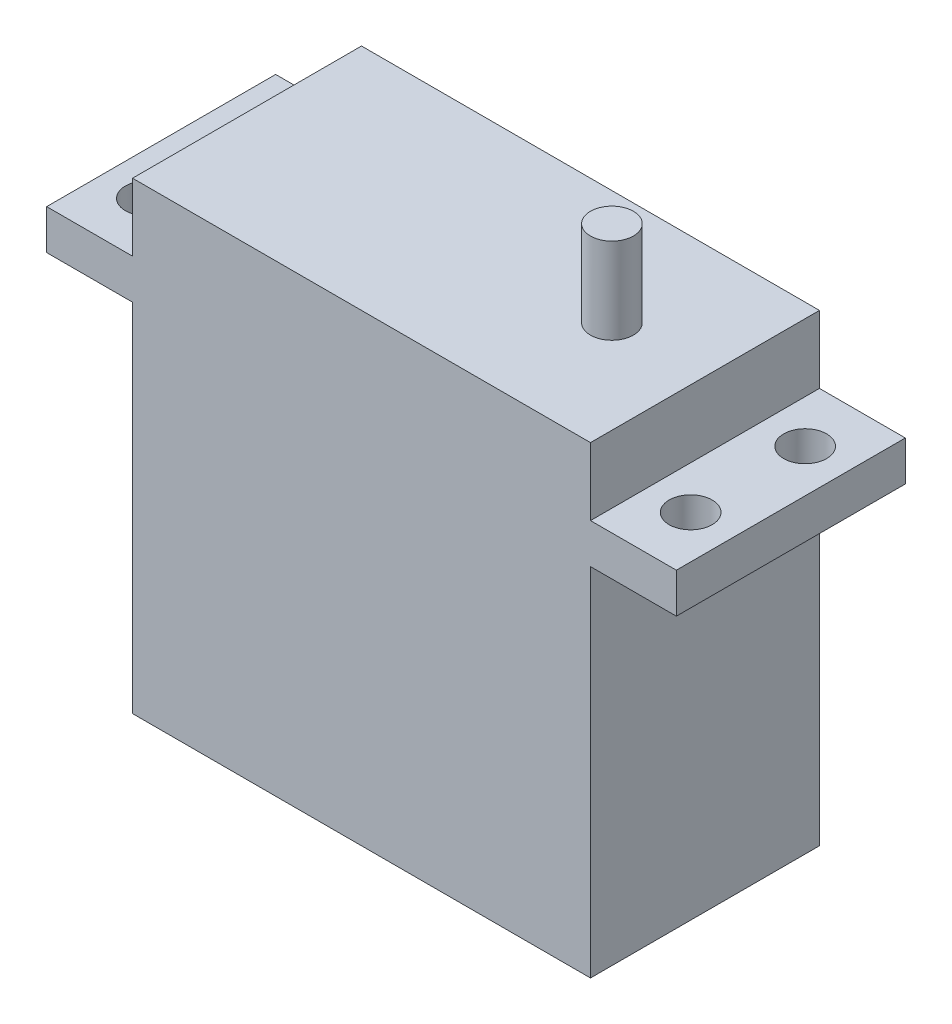
ISO-10303-21;
HEADER;
FILE_DESCRIPTION(('STEP AP214'),'2;1');
FILE_NAME('part.step','',(''),(''),'','','');
FILE_SCHEMA(('AUTOMOTIVE_DESIGN { 1 0 10303 214 1 1 1 1 }'));
ENDSEC;
DATA;
#1=APPLICATION_CONTEXT('core data for automotive mechanical design processes');
#2=APPLICATION_PROTOCOL_DEFINITION('international standard','automotive_design',2000,#1);
#3=PRODUCT_CONTEXT('',#1,'mechanical');
#4=PRODUCT('Part','Part','',(#3));
#5=PRODUCT_RELATED_PRODUCT_CATEGORY('part','',(#4));
#6=PRODUCT_DEFINITION_FORMATION('','',#4);
#7=PRODUCT_DEFINITION_CONTEXT('part definition',#1,'design');
#8=PRODUCT_DEFINITION('design','',#6,#7);
#9=PRODUCT_DEFINITION_SHAPE('','',#8);
#10=(LENGTH_UNIT() NAMED_UNIT(*) SI_UNIT(.MILLI.,.METRE.));
#11=(NAMED_UNIT(*) PLANE_ANGLE_UNIT() SI_UNIT($,.RADIAN.));
#12=(NAMED_UNIT(*) SI_UNIT($,.STERADIAN.) SOLID_ANGLE_UNIT());
#13=UNCERTAINTY_MEASURE_WITH_UNIT(LENGTH_MEASURE(1.E-05),#10,'distance_accuracy_value','');
#14=(GEOMETRIC_REPRESENTATION_CONTEXT(3) GLOBAL_UNCERTAINTY_ASSIGNED_CONTEXT((#13)) GLOBAL_UNIT_ASSIGNED_CONTEXT((#10,
#11,#12)) REPRESENTATION_CONTEXT('',''));
#15=CARTESIAN_POINT('',(0.,0.,0.));
#16=DIRECTION('',(0.,0.,1.));
#17=DIRECTION('',(1.,0.,0.));
#18=AXIS2_PLACEMENT_3D('',#15,#16,#17);
#19=CARTESIAN_POINT('',(0.,40.5,0.));
#20=DIRECTION('',(1.,0.,0.));
#21=DIRECTION('',(0.,0.,-1.));
#22=AXIS2_PLACEMENT_3D('',#19,#20,#21);
#23=PLANE('',#22);
#24=DIRECTION('',(0.,-1.,0.));
#25=VECTOR('',#24,1.);
#26=CARTESIAN_POINT('',(0.,40.5,-20.));
#27=LINE('',#26,#25);
#28=CARTESIAN_POINT('',(0.,40.5,-20.));
#29=VERTEX_POINT('',#28);
#30=CARTESIAN_POINT('',(0.,34.6,-20.));
#31=VERTEX_POINT('',#30);
#32=EDGE_CURVE('E207',#29,#31,#27,.T.);
#33=ORIENTED_EDGE('',*,*,#32,.T.);
#34=DIRECTION('',(0.,0.,1.));
#35=VECTOR('',#34,1.);
#36=CARTESIAN_POINT('',(0.,34.6,0.));
#37=LINE('',#36,#35);
#38=CARTESIAN_POINT('',(0.,34.6,0.));
#39=VERTEX_POINT('',#38);
#40=EDGE_CURVE('E183',#31,#39,#37,.T.);
#41=ORIENTED_EDGE('',*,*,#40,.T.);
#42=DIRECTION('',(0.,-1.,0.));
#43=VECTOR('',#42,1.);
#44=CARTESIAN_POINT('',(0.,40.5,0.));
#45=LINE('',#44,#43);
#46=CARTESIAN_POINT('',(0.,40.5,0.));
#47=VERTEX_POINT('',#46);
#48=EDGE_CURVE('E44',#47,#39,#45,.T.);
#49=ORIENTED_EDGE('',*,*,#48,.F.);
#50=DIRECTION('',(0.,0.,1.));
#51=VECTOR('',#50,1.);
#52=CARTESIAN_POINT('',(0.,40.5,0.));
#53=LINE('',#52,#51);
#54=EDGE_CURVE('E187',#29,#47,#53,.T.);
#55=ORIENTED_EDGE('',*,*,#54,.F.);
#56=EDGE_LOOP('',(#33,#41,#49,#55));
#57=FACE_BOUND('',#56,.T.);
#58=ADVANCED_FACE('F36',(#57),#23,.F.);
#59=CARTESIAN_POINT('',(40.,40.5,0.));
#60=DIRECTION('',(-1.,0.,0.));
#61=DIRECTION('',(0.,0.,1.));
#62=AXIS2_PLACEMENT_3D('',#59,#60,#61);
#63=PLANE('',#62);
#64=DIRECTION('',(0.,-1.,0.));
#65=VECTOR('',#64,1.);
#66=CARTESIAN_POINT('',(40.,40.5,0.));
#67=LINE('',#66,#65);
#68=CARTESIAN_POINT('',(40.,40.5,0.));
#69=VERTEX_POINT('',#68);
#70=CARTESIAN_POINT('',(40.,34.6,0.));
#71=VERTEX_POINT('',#70);
#72=EDGE_CURVE('E214',#69,#71,#67,.T.);
#73=ORIENTED_EDGE('',*,*,#72,.T.);
#74=DIRECTION('',(0.,0.,-1.));
#75=VECTOR('',#74,1.);
#76=CARTESIAN_POINT('',(40.,34.6,0.));
#77=LINE('',#76,#75);
#78=CARTESIAN_POINT('',(40.,34.6,-20.));
#79=VERTEX_POINT('',#78);
#80=EDGE_CURVE('E180',#71,#79,#77,.T.);
#81=ORIENTED_EDGE('',*,*,#80,.T.);
#82=DIRECTION('',(0.,-1.,0.));
#83=VECTOR('',#82,1.);
#84=CARTESIAN_POINT('',(40.,40.5,-20.));
#85=LINE('',#84,#83);
#86=CARTESIAN_POINT('',(40.,40.5,-20.));
#87=VERTEX_POINT('',#86);
#88=EDGE_CURVE('E211',#87,#79,#85,.T.);
#89=ORIENTED_EDGE('',*,*,#88,.F.);
#90=DIRECTION('',(0.,0.,-1.));
#91=VECTOR('',#90,1.);
#92=CARTESIAN_POINT('',(40.,40.5,0.));
#93=LINE('',#92,#91);
#94=EDGE_CURVE('E193',#69,#87,#93,.T.);
#95=ORIENTED_EDGE('',*,*,#94,.F.);
#96=EDGE_LOOP('',(#73,#81,#89,#95));
#97=FACE_BOUND('',#96,.T.);
#98=ADVANCED_FACE('F271',(#97),#63,.F.);
#99=CARTESIAN_POINT('',(0.,31.12,0.));
#100=VERTEX_POINT('',#99);
#101=CARTESIAN_POINT('',(0.,0.,0.));
#102=VERTEX_POINT('',#101);
#103=EDGE_CURVE('E217',#100,#102,#45,.T.);
#104=ORIENTED_EDGE('',*,*,#103,.F.);
#105=DIRECTION('',(0.,0.,-1.));
#106=VECTOR('',#105,1.);
#107=CARTESIAN_POINT('',(0.,31.12,0.));
#108=LINE('',#107,#106);
#109=CARTESIAN_POINT('',(0.,31.12,-20.));
#110=VERTEX_POINT('',#109);
#111=EDGE_CURVE('E178',#100,#110,#108,.T.);
#112=ORIENTED_EDGE('',*,*,#111,.T.);
#113=CARTESIAN_POINT('',(0.,0.,-20.));
#114=VERTEX_POINT('',#113);
#115=EDGE_CURVE('E197',#110,#114,#27,.T.);
#116=ORIENTED_EDGE('',*,*,#115,.T.);
#117=DIRECTION('',(0.,0.,1.));
#118=VECTOR('',#117,1.);
#119=CARTESIAN_POINT('',(0.,0.,0.));
#120=LINE('',#119,#118);
#121=EDGE_CURVE('E186',#114,#102,#120,.T.);
#122=ORIENTED_EDGE('',*,*,#121,.T.);
#123=EDGE_LOOP('',(#104,#112,#116,#122));
#124=FACE_BOUND('',#123,.T.);
#125=ADVANCED_FACE('F38',(#124),#23,.F.);
#126=CARTESIAN_POINT('',(0.,40.5,0.));
#127=DIRECTION('',(0.,0.,-1.));
#128=DIRECTION('',(-1.,0.,0.));
#129=AXIS2_PLACEMENT_3D('',#126,#127,#128);
#130=PLANE('',#129);
#131=CARTESIAN_POINT('',(40.,31.12,0.));
#132=VERTEX_POINT('',#131);
#133=CARTESIAN_POINT('',(40.,0.,0.));
#134=VERTEX_POINT('',#133);
#135=EDGE_CURVE('E130',#132,#134,#67,.T.);
#136=ORIENTED_EDGE('',*,*,#135,.F.);
#137=DIRECTION('',(1.,0.,0.));
#138=VECTOR('',#137,1.);
#139=CARTESIAN_POINT('',(-7.5,31.12,0.));
#140=LINE('',#139,#138);
#141=CARTESIAN_POINT('',(47.5,31.12,0.));
#142=VERTEX_POINT('',#141);
#143=EDGE_CURVE('E51',#132,#142,#140,.T.);
#144=ORIENTED_EDGE('',*,*,#143,.T.);
#145=DIRECTION('',(0.,-1.,0.));
#146=VECTOR('',#145,1.);
#147=CARTESIAN_POINT('',(47.5,31.12,0.));
#148=LINE('',#147,#146);
#149=CARTESIAN_POINT('',(47.5,34.6,0.));
#150=VERTEX_POINT('',#149);
#151=EDGE_CURVE('E128',#150,#142,#148,.T.);
#152=ORIENTED_EDGE('',*,*,#151,.F.);
#153=DIRECTION('',(1.,0.,0.));
#154=VECTOR('',#153,1.);
#155=CARTESIAN_POINT('',(-7.5,34.6,0.));
#156=LINE('',#155,#154);
#157=EDGE_CURVE('E170',#71,#150,#156,.T.);
#158=ORIENTED_EDGE('',*,*,#157,.F.);
#159=ORIENTED_EDGE('',*,*,#72,.F.);
#160=DIRECTION('',(1.,0.,0.));
#161=VECTOR('',#160,1.);
#162=CARTESIAN_POINT('',(0.,40.5,0.));
#163=LINE('',#162,#161);
#164=EDGE_CURVE('E190',#47,#69,#163,.T.);
#165=ORIENTED_EDGE('',*,*,#164,.F.);
#166=ORIENTED_EDGE('',*,*,#48,.T.);
#167=CARTESIAN_POINT('',(-7.5,34.6,0.));
#168=VERTEX_POINT('',#167);
#169=EDGE_CURVE('E167',#168,#39,#156,.T.);
#170=ORIENTED_EDGE('',*,*,#169,.F.);
#171=DIRECTION('',(0.,-1.,0.));
#172=VECTOR('',#171,1.);
#173=CARTESIAN_POINT('',(-7.5,31.12,0.));
#174=LINE('',#173,#172);
#175=CARTESIAN_POINT('',(-7.5,31.12,0.));
#176=VERTEX_POINT('',#175);
#177=EDGE_CURVE('E157',#168,#176,#174,.T.);
#178=ORIENTED_EDGE('',*,*,#177,.T.);
#179=EDGE_CURVE('E131',#176,#100,#140,.T.);
#180=ORIENTED_EDGE('',*,*,#179,.T.);
#181=ORIENTED_EDGE('',*,*,#103,.T.);
#182=DIRECTION('',(1.,0.,0.));
#183=VECTOR('',#182,1.);
#184=CARTESIAN_POINT('',(0.,0.,0.));
#185=LINE('',#184,#183);
#186=EDGE_CURVE('E200',#102,#134,#185,.T.);
#187=ORIENTED_EDGE('',*,*,#186,.T.);
#188=EDGE_LOOP('',(#136,#144,#152,#158,#159,#165,#166,#170,#178,#180,#181,#187));
#189=FACE_BOUND('',#188,.T.);
#190=ADVANCED_FACE('F125',(#189),#130,.F.);
#191=CARTESIAN_POINT('',(40.,31.12,-20.));
#192=VERTEX_POINT('',#191);
#193=CARTESIAN_POINT('',(40.,0.,-20.));
#194=VERTEX_POINT('',#193);
#195=EDGE_CURVE('E210',#192,#194,#85,.T.);
#196=ORIENTED_EDGE('',*,*,#195,.F.);
#197=DIRECTION('',(0.,0.,1.));
#198=VECTOR('',#197,1.);
#199=CARTESIAN_POINT('',(40.,31.12,0.));
#200=LINE('',#199,#198);
#201=EDGE_CURVE('E169',#192,#132,#200,.T.);
#202=ORIENTED_EDGE('',*,*,#201,.T.);
#203=ORIENTED_EDGE('',*,*,#135,.T.);
#204=DIRECTION('',(0.,0.,-1.));
#205=VECTOR('',#204,1.);
#206=CARTESIAN_POINT('',(40.,0.,0.));
#207=LINE('',#206,#205);
#208=EDGE_CURVE('E202',#134,#194,#207,.T.);
#209=ORIENTED_EDGE('',*,*,#208,.T.);
#210=EDGE_LOOP('',(#196,#202,#203,#209));
#211=FACE_BOUND('',#210,.T.);
#212=ADVANCED_FACE('F290',(#211),#63,.F.);
#213=CARTESIAN_POINT('',(0.,40.5,-20.));
#214=DIRECTION('',(0.,0.,1.));
#215=DIRECTION('',(1.,0.,0.));
#216=AXIS2_PLACEMENT_3D('',#213,#214,#215);
#217=PLANE('',#216);
#218=ORIENTED_EDGE('',*,*,#115,.F.);
#219=DIRECTION('',(1.,0.,0.));
#220=VECTOR('',#219,1.);
#221=CARTESIAN_POINT('',(-7.5,31.12,-20.));
#222=LINE('',#221,#220);
#223=CARTESIAN_POINT('',(-7.5,31.12,-20.));
#224=VERTEX_POINT('',#223);
#225=EDGE_CURVE('E59',#224,#110,#222,.T.);
#226=ORIENTED_EDGE('',*,*,#225,.F.);
#227=DIRECTION('',(0.,1.,0.));
#228=VECTOR('',#227,1.);
#229=CARTESIAN_POINT('',(-7.5,31.12,-20.));
#230=LINE('',#229,#228);
#231=CARTESIAN_POINT('',(-7.5,34.6,-20.));
#232=VERTEX_POINT('',#231);
#233=EDGE_CURVE('E162',#224,#232,#230,.T.);
#234=ORIENTED_EDGE('',*,*,#233,.T.);
#235=DIRECTION('',(1.,0.,0.));
#236=VECTOR('',#235,1.);
#237=CARTESIAN_POINT('',(-7.5,34.6,-20.));
#238=LINE('',#237,#236);
#239=EDGE_CURVE('E171',#232,#31,#238,.T.);
#240=ORIENTED_EDGE('',*,*,#239,.T.);
#241=ORIENTED_EDGE('',*,*,#32,.F.);
#242=DIRECTION('',(-1.,0.,0.));
#243=VECTOR('',#242,1.);
#244=CARTESIAN_POINT('',(0.,40.5,-20.));
#245=LINE('',#244,#243);
#246=EDGE_CURVE('E195',#87,#29,#245,.T.);
#247=ORIENTED_EDGE('',*,*,#246,.F.);
#248=ORIENTED_EDGE('',*,*,#88,.T.);
#249=CARTESIAN_POINT('',(47.5,34.6,-20.));
#250=VERTEX_POINT('',#249);
#251=EDGE_CURVE('E174',#79,#250,#238,.T.);
#252=ORIENTED_EDGE('',*,*,#251,.T.);
#253=DIRECTION('',(0.,1.,0.));
#254=VECTOR('',#253,1.);
#255=CARTESIAN_POINT('',(47.5,31.12,-20.));
#256=LINE('',#255,#254);
#257=CARTESIAN_POINT('',(47.5,31.12,-20.));
#258=VERTEX_POINT('',#257);
#259=EDGE_CURVE('E142',#258,#250,#256,.T.);
#260=ORIENTED_EDGE('',*,*,#259,.F.);
#261=EDGE_CURVE('E138',#192,#258,#222,.T.);
#262=ORIENTED_EDGE('',*,*,#261,.F.);
#263=ORIENTED_EDGE('',*,*,#195,.T.);
#264=DIRECTION('',(-1.,0.,0.));
#265=VECTOR('',#264,1.);
#266=CARTESIAN_POINT('',(0.,0.,-20.));
#267=LINE('',#266,#265);
#268=EDGE_CURVE('E191',#194,#114,#267,.T.);
#269=ORIENTED_EDGE('',*,*,#268,.T.);
#270=EDGE_LOOP('',(#218,#226,#234,#240,#241,#247,#248,#252,#260,#262,#263,#269));
#271=FACE_BOUND('',#270,.T.);
#272=ADVANCED_FACE('F259',(#271),#217,.F.);
#273=CARTESIAN_POINT('',(0.,40.5,0.));
#274=DIRECTION('',(0.,-1.,0.));
#275=DIRECTION('',(0.,0.,-1.));
#276=AXIS2_PLACEMENT_3D('',#273,#274,#275);
#277=PLANE('',#276);
#278=CARTESIAN_POINT('',(31.8724,40.5,-10.));
#279=DIRECTION('',(0.,-1.,0.));
#280=DIRECTION('',(0.,0.,-1.));
#281=AXIS2_PLACEMENT_3D('',#278,#279,#280);
#282=CIRCLE('',#281,1.875);
#283=CARTESIAN_POINT('',(31.8724,40.5,-11.875));
#284=VERTEX_POINT('',#283);
#285=EDGE_CURVE('E11',#284,#284,#282,.F.);
#286=ORIENTED_EDGE('',*,*,#285,.F.);
#287=EDGE_LOOP('',(#286));
#288=FACE_BOUND('',#287,.T.);
#289=ORIENTED_EDGE('',*,*,#54,.T.);
#290=ORIENTED_EDGE('',*,*,#164,.T.);
#291=ORIENTED_EDGE('',*,*,#94,.T.);
#292=ORIENTED_EDGE('',*,*,#246,.T.);
#293=EDGE_LOOP('',(#289,#290,#291,#292));
#294=FACE_BOUND('',#293,.T.);
#295=ADVANCED_FACE('F255',(#288,#294),#277,.F.);
#296=CARTESIAN_POINT('',(0.,0.,0.));
#297=DIRECTION('',(0.,-1.,0.));
#298=DIRECTION('',(0.,0.,-1.));
#299=AXIS2_PLACEMENT_3D('',#296,#297,#298);
#300=PLANE('',#299);
#301=ORIENTED_EDGE('',*,*,#121,.F.);
#302=ORIENTED_EDGE('',*,*,#268,.F.);
#303=ORIENTED_EDGE('',*,*,#208,.F.);
#304=ORIENTED_EDGE('',*,*,#186,.F.);
#305=EDGE_LOOP('',(#301,#302,#303,#304));
#306=FACE_BOUND('',#305,.T.);
#307=ADVANCED_FACE('F258',(#306),#300,.T.);
#308=CARTESIAN_POINT('',(47.5,0.,0.));
#309=DIRECTION('',(-1.,0.,0.));
#310=DIRECTION('',(0.,0.,1.));
#311=AXIS2_PLACEMENT_3D('',#308,#309,#310);
#312=PLANE('',#311);
#313=ORIENTED_EDGE('',*,*,#151,.T.);
#314=DIRECTION('',(0.,0.,-1.));
#315=VECTOR('',#314,1.);
#316=CARTESIAN_POINT('',(47.5,31.12,0.));
#317=LINE('',#316,#315);
#318=EDGE_CURVE('E135',#142,#258,#317,.T.);
#319=ORIENTED_EDGE('',*,*,#318,.T.);
#320=ORIENTED_EDGE('',*,*,#259,.T.);
#321=DIRECTION('',(0.,0.,1.));
#322=VECTOR('',#321,1.);
#323=CARTESIAN_POINT('',(47.5,34.6,0.));
#324=LINE('',#323,#322);
#325=EDGE_CURVE('E147',#250,#150,#324,.T.);
#326=ORIENTED_EDGE('',*,*,#325,.T.);
#327=EDGE_LOOP('',(#313,#319,#320,#326));
#328=FACE_BOUND('',#327,.T.);
#329=ADVANCED_FACE('F145',(#328),#312,.F.);
#330=CARTESIAN_POINT('',(-7.5,31.12,0.));
#331=DIRECTION('',(0.,-1.,0.));
#332=DIRECTION('',(0.,0.,-1.));
#333=AXIS2_PLACEMENT_3D('',#330,#331,#332);
#334=PLANE('',#333);
#335=CARTESIAN_POINT('',(43.75,31.12,-5.));
#336=DIRECTION('',(0.,-1.,0.));
#337=DIRECTION('',(0.,0.,-1.));
#338=AXIS2_PLACEMENT_3D('',#335,#336,#337);
#339=CIRCLE('',#338,1.875);
#340=CARTESIAN_POINT('',(43.75,31.12,-6.875));
#341=VERTEX_POINT('',#340);
#342=EDGE_CURVE('E148',#341,#341,#339,.T.);
#343=ORIENTED_EDGE('',*,*,#342,.F.);
#344=EDGE_LOOP('',(#343));
#345=FACE_BOUND('',#344,.T.);
#346=CARTESIAN_POINT('',(43.75,31.12,-15.));
#347=DIRECTION('',(0.,-1.,0.));
#348=DIRECTION('',(0.,0.,-1.));
#349=AXIS2_PLACEMENT_3D('',#346,#347,#348);
#350=CIRCLE('',#349,1.875);
#351=CARTESIAN_POINT('',(43.75,31.12,-16.875));
#352=VERTEX_POINT('',#351);
#353=EDGE_CURVE('E151',#352,#352,#350,.T.);
#354=ORIENTED_EDGE('',*,*,#353,.F.);
#355=EDGE_LOOP('',(#354));
#356=FACE_BOUND('',#355,.T.);
#357=ORIENTED_EDGE('',*,*,#201,.F.);
#358=ORIENTED_EDGE('',*,*,#261,.T.);
#359=ORIENTED_EDGE('',*,*,#318,.F.);
#360=ORIENTED_EDGE('',*,*,#143,.F.);
#361=EDGE_LOOP('',(#357,#358,#359,#360));
#362=FACE_BOUND('',#361,.T.);
#363=ADVANCED_FACE('F136',(#345,#356,#362),#334,.T.);
#364=CARTESIAN_POINT('',(-7.5,34.6,0.));
#365=DIRECTION('',(0.,1.,0.));
#366=DIRECTION('',(0.,0.,1.));
#367=AXIS2_PLACEMENT_3D('',#364,#365,#366);
#368=PLANE('',#367);
#369=CARTESIAN_POINT('',(43.75,34.6,-5.));
#370=DIRECTION('',(0.,1.,0.));
#371=DIRECTION('',(0.,0.,1.));
#372=AXIS2_PLACEMENT_3D('',#369,#370,#371);
#373=CIRCLE('',#372,1.875);
#374=CARTESIAN_POINT('',(43.75,34.6,-3.125));
#375=VERTEX_POINT('',#374);
#376=EDGE_CURVE('E233',#375,#375,#373,.T.);
#377=ORIENTED_EDGE('',*,*,#376,.F.);
#378=EDGE_LOOP('',(#377));
#379=FACE_BOUND('',#378,.T.);
#380=CARTESIAN_POINT('',(43.75,34.6,-15.));
#381=DIRECTION('',(0.,1.,0.));
#382=DIRECTION('',(0.,0.,1.));
#383=AXIS2_PLACEMENT_3D('',#380,#381,#382);
#384=CIRCLE('',#383,1.875);
#385=CARTESIAN_POINT('',(43.75,34.6,-13.125));
#386=VERTEX_POINT('',#385);
#387=EDGE_CURVE('E223',#386,#386,#384,.T.);
#388=ORIENTED_EDGE('',*,*,#387,.F.);
#389=EDGE_LOOP('',(#388));
#390=FACE_BOUND('',#389,.T.);
#391=ORIENTED_EDGE('',*,*,#80,.F.);
#392=ORIENTED_EDGE('',*,*,#157,.T.);
#393=ORIENTED_EDGE('',*,*,#325,.F.);
#394=ORIENTED_EDGE('',*,*,#251,.F.);
#395=EDGE_LOOP('',(#391,#392,#393,#394));
#396=FACE_BOUND('',#395,.T.);
#397=ADVANCED_FACE('F292',(#379,#390,#396),#368,.T.);
#398=CARTESIAN_POINT('',(-3.75,34.6,-15.));
#399=DIRECTION('',(0.,1.,0.));
#400=DIRECTION('',(0.,0.,1.));
#401=AXIS2_PLACEMENT_3D('',#398,#399,#400);
#402=CIRCLE('',#401,1.875);
#403=CARTESIAN_POINT('',(-3.75,34.6,-13.125));
#404=VERTEX_POINT('',#403);
#405=EDGE_CURVE('E234',#404,#404,#402,.T.);
#406=ORIENTED_EDGE('',*,*,#405,.F.);
#407=EDGE_LOOP('',(#406));
#408=FACE_BOUND('',#407,.T.);
#409=CARTESIAN_POINT('',(-3.75,34.6,-5.));
#410=DIRECTION('',(0.,1.,0.));
#411=DIRECTION('',(0.,0.,1.));
#412=AXIS2_PLACEMENT_3D('',#409,#410,#411);
#413=CIRCLE('',#412,1.875);
#414=CARTESIAN_POINT('',(-3.75,34.6,-3.125));
#415=VERTEX_POINT('',#414);
#416=EDGE_CURVE('E237',#415,#415,#413,.T.);
#417=ORIENTED_EDGE('',*,*,#416,.F.);
#418=EDGE_LOOP('',(#417));
#419=FACE_BOUND('',#418,.T.);
#420=ORIENTED_EDGE('',*,*,#40,.F.);
#421=ORIENTED_EDGE('',*,*,#239,.F.);
#422=DIRECTION('',(0.,0.,1.));
#423=VECTOR('',#422,1.);
#424=CARTESIAN_POINT('',(-7.5,34.6,0.));
#425=LINE('',#424,#423);
#426=EDGE_CURVE('E132',#232,#168,#425,.T.);
#427=ORIENTED_EDGE('',*,*,#426,.T.);
#428=ORIENTED_EDGE('',*,*,#169,.T.);
#429=EDGE_LOOP('',(#420,#421,#427,#428));
#430=FACE_BOUND('',#429,.T.);
#431=ADVANCED_FACE('F277',(#408,#419,#430),#368,.T.);
#432=CARTESIAN_POINT('',(-3.75,31.12,-15.));
#433=DIRECTION('',(0.,-1.,0.));
#434=DIRECTION('',(0.,0.,-1.));
#435=AXIS2_PLACEMENT_3D('',#432,#433,#434);
#436=CIRCLE('',#435,1.875);
#437=CARTESIAN_POINT('',(-3.75,31.12,-16.875));
#438=VERTEX_POINT('',#437);
#439=EDGE_CURVE('E222',#438,#438,#436,.T.);
#440=ORIENTED_EDGE('',*,*,#439,.F.);
#441=EDGE_LOOP('',(#440));
#442=FACE_BOUND('',#441,.T.);
#443=CARTESIAN_POINT('',(-3.75,31.12,-5.));
#444=DIRECTION('',(0.,-1.,0.));
#445=DIRECTION('',(0.,0.,-1.));
#446=AXIS2_PLACEMENT_3D('',#443,#444,#445);
#447=CIRCLE('',#446,1.875);
#448=CARTESIAN_POINT('',(-3.75,31.12,-6.875));
#449=VERTEX_POINT('',#448);
#450=EDGE_CURVE('E220',#449,#449,#447,.T.);
#451=ORIENTED_EDGE('',*,*,#450,.F.);
#452=EDGE_LOOP('',(#451));
#453=FACE_BOUND('',#452,.T.);
#454=ORIENTED_EDGE('',*,*,#111,.F.);
#455=ORIENTED_EDGE('',*,*,#179,.F.);
#456=DIRECTION('',(0.,0.,-1.));
#457=VECTOR('',#456,1.);
#458=CARTESIAN_POINT('',(-7.5,31.12,0.));
#459=LINE('',#458,#457);
#460=EDGE_CURVE('E160',#176,#224,#459,.T.);
#461=ORIENTED_EDGE('',*,*,#460,.T.);
#462=ORIENTED_EDGE('',*,*,#225,.T.);
#463=EDGE_LOOP('',(#454,#455,#461,#462));
#464=FACE_BOUND('',#463,.T.);
#465=ADVANCED_FACE('F300',(#442,#453,#464),#334,.T.);
#466=CARTESIAN_POINT('',(-7.5,0.,0.));
#467=DIRECTION('',(-1.,0.,0.));
#468=DIRECTION('',(0.,0.,1.));
#469=AXIS2_PLACEMENT_3D('',#466,#467,#468);
#470=PLANE('',#469);
#471=ORIENTED_EDGE('',*,*,#177,.F.);
#472=ORIENTED_EDGE('',*,*,#426,.F.);
#473=ORIENTED_EDGE('',*,*,#233,.F.);
#474=ORIENTED_EDGE('',*,*,#460,.F.);
#475=EDGE_LOOP('',(#471,#472,#473,#474));
#476=FACE_BOUND('',#475,.T.);
#477=ADVANCED_FACE('F279',(#476),#470,.T.);
#478=CARTESIAN_POINT('',(-3.75,0.,-5.));
#479=DIRECTION('',(0.,1.,0.));
#480=DIRECTION('',(0.,0.,1.));
#481=AXIS2_PLACEMENT_3D('',#478,#479,#480);
#482=CYLINDRICAL_SURFACE('',#481,1.875);
#483=ORIENTED_EDGE('',*,*,#450,.T.);
#484=EDGE_LOOP('',(#483));
#485=FACE_BOUND('',#484,.T.);
#486=ORIENTED_EDGE('',*,*,#416,.T.);
#487=EDGE_LOOP('',(#486));
#488=FACE_BOUND('',#487,.T.);
#489=ADVANCED_FACE('F328',(#485,#488),#482,.F.);
#490=CARTESIAN_POINT('',(-3.75,0.,-15.));
#491=DIRECTION('',(0.,1.,0.));
#492=DIRECTION('',(0.,0.,1.));
#493=AXIS2_PLACEMENT_3D('',#490,#491,#492);
#494=CYLINDRICAL_SURFACE('',#493,1.875);
#495=ORIENTED_EDGE('',*,*,#439,.T.);
#496=EDGE_LOOP('',(#495));
#497=FACE_BOUND('',#496,.T.);
#498=ORIENTED_EDGE('',*,*,#405,.T.);
#499=EDGE_LOOP('',(#498));
#500=FACE_BOUND('',#499,.T.);
#501=ADVANCED_FACE('F334',(#497,#500),#494,.F.);
#502=CARTESIAN_POINT('',(43.75,0.,-15.));
#503=DIRECTION('',(0.,1.,0.));
#504=DIRECTION('',(0.,0.,1.));
#505=AXIS2_PLACEMENT_3D('',#502,#503,#504);
#506=CYLINDRICAL_SURFACE('',#505,1.875);
#507=ORIENTED_EDGE('',*,*,#353,.T.);
#508=EDGE_LOOP('',(#507));
#509=FACE_BOUND('',#508,.T.);
#510=ORIENTED_EDGE('',*,*,#387,.T.);
#511=EDGE_LOOP('',(#510));
#512=FACE_BOUND('',#511,.T.);
#513=ADVANCED_FACE('F341',(#509,#512),#506,.F.);
#514=CARTESIAN_POINT('',(43.75,0.,-5.));
#515=DIRECTION('',(0.,1.,0.));
#516=DIRECTION('',(0.,0.,1.));
#517=AXIS2_PLACEMENT_3D('',#514,#515,#516);
#518=CYLINDRICAL_SURFACE('',#517,1.875);
#519=ORIENTED_EDGE('',*,*,#342,.T.);
#520=EDGE_LOOP('',(#519));
#521=FACE_BOUND('',#520,.T.);
#522=ORIENTED_EDGE('',*,*,#376,.T.);
#523=EDGE_LOOP('',(#522));
#524=FACE_BOUND('',#523,.T.);
#525=ADVANCED_FACE('F251',(#521,#524),#518,.F.);
#526=CARTESIAN_POINT('',(31.8724,48.,-10.));
#527=DIRECTION('',(0.,-1.,0.));
#528=DIRECTION('',(0.,0.,-1.));
#529=AXIS2_PLACEMENT_3D('',#526,#527,#528);
#530=CYLINDRICAL_SURFACE('',#529,1.875);
#531=CARTESIAN_POINT('',(31.8724,48.,-10.));
#532=DIRECTION('',(0.,1.,0.));
#533=DIRECTION('',(0.,0.,1.));
#534=AXIS2_PLACEMENT_3D('',#531,#532,#533);
#535=CIRCLE('',#534,1.875);
#536=CARTESIAN_POINT('',(31.8724,48.,-8.125));
#537=VERTEX_POINT('',#536);
#538=EDGE_CURVE('E242',#537,#537,#535,.T.);
#539=ORIENTED_EDGE('',*,*,#538,.F.);
#540=EDGE_LOOP('',(#539));
#541=FACE_BOUND('',#540,.T.);
#542=ORIENTED_EDGE('',*,*,#285,.T.);
#543=EDGE_LOOP('',(#542));
#544=FACE_BOUND('',#543,.T.);
#545=ADVANCED_FACE('F248',(#541,#544),#530,.T.);
#546=CARTESIAN_POINT('',(31.8724,48.,-10.));
#547=DIRECTION('',(0.,1.,0.));
#548=DIRECTION('',(0.,0.,1.));
#549=AXIS2_PLACEMENT_3D('',#546,#547,#548);
#550=PLANE('',#549);
#551=ORIENTED_EDGE('',*,*,#538,.T.);
#552=EDGE_LOOP('',(#551));
#553=FACE_BOUND('',#552,.T.);
#554=ADVANCED_FACE('F246',(#553),#550,.T.);
#555=CLOSED_SHELL('',(#58,#98,#125,#190,#212,#272,#295,#307,#329,#363,#397,#431,#465,#477,#489,
#501,#513,#525,#545,#554));
#556=MANIFOLD_SOLID_BREP('B2',#555);
#557=ADVANCED_BREP_SHAPE_REPRESENTATION('',(#18,#556),#14);
#558=SHAPE_DEFINITION_REPRESENTATION(#9,#557);
ENDSEC;
END-ISO-10303-21;
